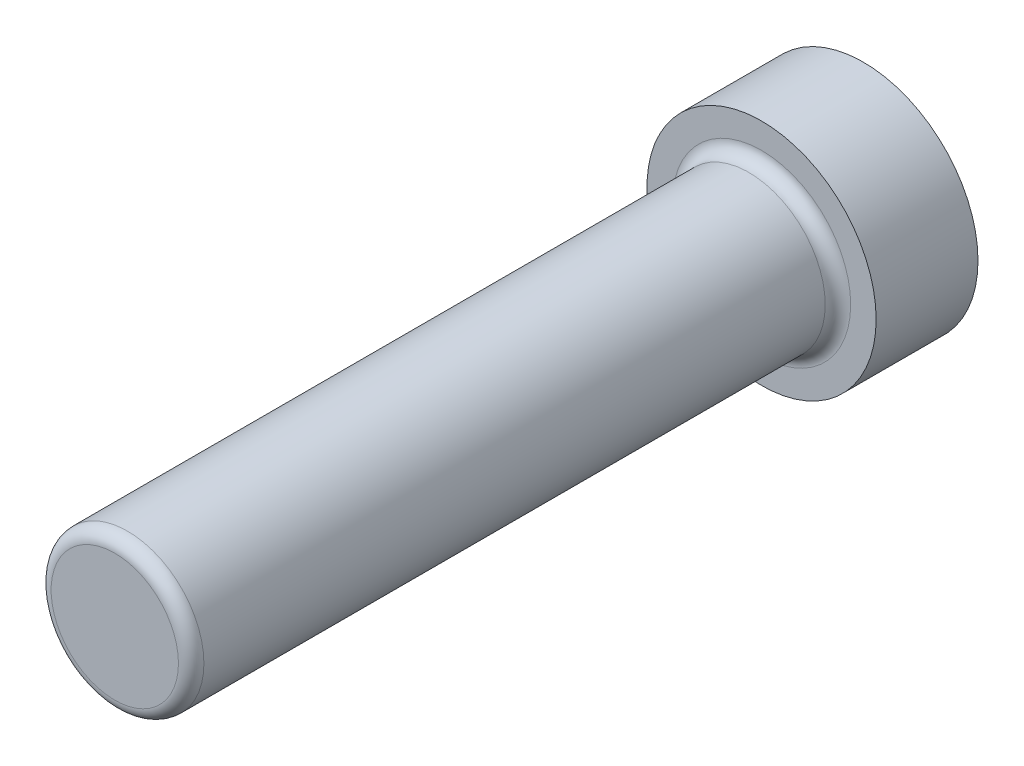
ISO-10303-21;
HEADER;
FILE_DESCRIPTION(('STEP AP214'),'2;1');
FILE_NAME('part.step','',(''),(''),'','','');
FILE_SCHEMA(('AUTOMOTIVE_DESIGN { 1 0 10303 214 1 1 1 1 }'));
ENDSEC;
DATA;
#1=APPLICATION_CONTEXT('core data for automotive mechanical design processes');
#2=APPLICATION_PROTOCOL_DEFINITION('international standard','automotive_design',2000,#1);
#3=PRODUCT_CONTEXT('',#1,'mechanical');
#4=PRODUCT('Part','Part','',(#3));
#5=PRODUCT_RELATED_PRODUCT_CATEGORY('part','',(#4));
#6=PRODUCT_DEFINITION_FORMATION('','',#4);
#7=PRODUCT_DEFINITION_CONTEXT('part definition',#1,'design');
#8=PRODUCT_DEFINITION('design','',#6,#7);
#9=PRODUCT_DEFINITION_SHAPE('','',#8);
#10=(LENGTH_UNIT() NAMED_UNIT(*) SI_UNIT(.MILLI.,.METRE.));
#11=(NAMED_UNIT(*) PLANE_ANGLE_UNIT() SI_UNIT($,.RADIAN.));
#12=(NAMED_UNIT(*) SI_UNIT($,.STERADIAN.) SOLID_ANGLE_UNIT());
#13=UNCERTAINTY_MEASURE_WITH_UNIT(LENGTH_MEASURE(1.E-05),#10,'distance_accuracy_value','');
#14=(GEOMETRIC_REPRESENTATION_CONTEXT(3) GLOBAL_UNCERTAINTY_ASSIGNED_CONTEXT((#13)) GLOBAL_UNIT_ASSIGNED_CONTEXT((#10,
#11,#12)) REPRESENTATION_CONTEXT('',''));
#15=CARTESIAN_POINT('',(0.,0.,0.));
#16=DIRECTION('',(0.,0.,1.));
#17=DIRECTION('',(1.,0.,0.));
#18=AXIS2_PLACEMENT_3D('',#15,#16,#17);
#19=CARTESIAN_POINT('',(0.,0.,12.7));
#20=DIRECTION('',(0.,0.,-1.));
#21=DIRECTION('',(-1.,0.,0.));
#22=AXIS2_PLACEMENT_3D('',#19,#20,#21);
#23=CYLINDRICAL_SURFACE('',#22,1.5);
#24=CARTESIAN_POINT('',(0.,0.,0.25));
#25=DIRECTION('',(0.,0.,1.));
#26=DIRECTION('',(1.,0.,0.));
#27=AXIS2_PLACEMENT_3D('',#24,#25,#26);
#28=CIRCLE('',#27,1.5);
#29=CARTESIAN_POINT('',(1.5,0.,0.25));
#30=VERTEX_POINT('',#29);
#31=EDGE_CURVE('E39',#30,#30,#28,.T.);
#32=ORIENTED_EDGE('',*,*,#31,.T.);
#33=EDGE_LOOP('',(#32));
#34=FACE_BOUND('',#33,.T.);
#35=CARTESIAN_POINT('',(0.,0.,12.45));
#36=DIRECTION('',(0.,0.,1.));
#37=DIRECTION('',(1.,0.,0.));
#38=AXIS2_PLACEMENT_3D('',#35,#36,#37);
#39=CIRCLE('',#38,1.5);
#40=CARTESIAN_POINT('',(1.5,0.,12.45));
#41=VERTEX_POINT('',#40);
#42=EDGE_CURVE('E43',#41,#41,#39,.F.);
#43=ORIENTED_EDGE('',*,*,#42,.T.);
#44=EDGE_LOOP('',(#43));
#45=FACE_BOUND('',#44,.T.);
#46=ADVANCED_FACE('F32',(#34,#45),#23,.T.);
#47=CARTESIAN_POINT('',(0.,0.,12.7));
#48=DIRECTION('',(0.,0.,1.));
#49=DIRECTION('',(1.,0.,0.));
#50=AXIS2_PLACEMENT_3D('',#47,#48,#49);
#51=PLANE('',#50);
#52=CARTESIAN_POINT('',(0.,0.,12.7));
#53=DIRECTION('',(0.,0.,1.));
#54=DIRECTION('',(1.,0.,0.));
#55=AXIS2_PLACEMENT_3D('',#52,#53,#54);
#56=CIRCLE('',#55,1.25);
#57=CARTESIAN_POINT('',(1.25,0.,12.7));
#58=VERTEX_POINT('',#57);
#59=EDGE_CURVE('E47',#58,#58,#56,.T.);
#60=ORIENTED_EDGE('',*,*,#59,.T.);
#61=EDGE_LOOP('',(#60));
#62=FACE_BOUND('',#61,.T.);
#63=ADVANCED_FACE('F72',(#62),#51,.T.);
#64=CARTESIAN_POINT('',(0.,0.,-2.));
#65=DIRECTION('',(0.,0.,1.));
#66=DIRECTION('',(1.,0.,0.));
#67=AXIS2_PLACEMENT_3D('',#64,#65,#66);
#68=CYLINDRICAL_SURFACE('',#67,2.25);
#69=CARTESIAN_POINT('',(0.,0.,-2.));
#70=DIRECTION('',(0.,0.,1.));
#71=DIRECTION('',(1.,0.,0.));
#72=AXIS2_PLACEMENT_3D('',#69,#70,#71);
#73=CIRCLE('',#72,2.25);
#74=CARTESIAN_POINT('',(2.25,0.,-2.));
#75=VERTEX_POINT('',#74);
#76=EDGE_CURVE('E52',#75,#75,#73,.T.);
#77=ORIENTED_EDGE('',*,*,#76,.T.);
#78=EDGE_LOOP('',(#77));
#79=FACE_BOUND('',#78,.T.);
#80=CARTESIAN_POINT('',(0.,0.,0.));
#81=DIRECTION('',(0.,0.,1.));
#82=DIRECTION('',(1.,0.,0.));
#83=AXIS2_PLACEMENT_3D('',#80,#81,#82);
#84=CIRCLE('',#83,2.25);
#85=CARTESIAN_POINT('',(2.25,0.,0.));
#86=VERTEX_POINT('',#85);
#87=EDGE_CURVE('E53',#86,#86,#84,.T.);
#88=ORIENTED_EDGE('',*,*,#87,.F.);
#89=EDGE_LOOP('',(#88));
#90=FACE_BOUND('',#89,.T.);
#91=ADVANCED_FACE('F59',(#79,#90),#68,.T.);
#92=CARTESIAN_POINT('',(0.,0.,-2.));
#93=DIRECTION('',(0.,0.,1.));
#94=DIRECTION('',(1.,0.,0.));
#95=AXIS2_PLACEMENT_3D('',#92,#93,#94);
#96=PLANE('',#95);
#97=ORIENTED_EDGE('',*,*,#76,.F.);
#98=EDGE_LOOP('',(#97));
#99=FACE_BOUND('',#98,.T.);
#100=ADVANCED_FACE('F62',(#99),#96,.F.);
#101=CARTESIAN_POINT('',(0.,0.,0.));
#102=DIRECTION('',(0.,0.,1.));
#103=DIRECTION('',(1.,0.,0.));
#104=AXIS2_PLACEMENT_3D('',#101,#102,#103);
#105=PLANE('',#104);
#106=CARTESIAN_POINT('',(0.,0.,0.));
#107=DIRECTION('',(0.,0.,1.));
#108=DIRECTION('',(1.,0.,0.));
#109=AXIS2_PLACEMENT_3D('',#106,#107,#108);
#110=CIRCLE('',#109,1.75);
#111=CARTESIAN_POINT('',(1.75,0.,0.));
#112=VERTEX_POINT('',#111);
#113=EDGE_CURVE('E10',#112,#112,#110,.F.);
#114=ORIENTED_EDGE('',*,*,#113,.T.);
#115=EDGE_LOOP('',(#114));
#116=FACE_BOUND('',#115,.T.);
#117=ORIENTED_EDGE('',*,*,#87,.T.);
#118=EDGE_LOOP('',(#117));
#119=FACE_BOUND('',#118,.T.);
#120=ADVANCED_FACE('F64',(#116,#119),#105,.T.);
#121=CARTESIAN_POINT('',(0.,0.,12.45));
#122=DIRECTION('',(0.,0.,1.));
#123=DIRECTION('',(1.,0.,0.));
#124=AXIS2_PLACEMENT_3D('',#121,#122,#123);
#125=TOROIDAL_SURFACE('',#124,1.25,0.25);
#126=ORIENTED_EDGE('',*,*,#42,.F.);
#127=EDGE_LOOP('',(#126));
#128=FACE_BOUND('',#127,.T.);
#129=ORIENTED_EDGE('',*,*,#59,.F.);
#130=EDGE_LOOP('',(#129));
#131=FACE_BOUND('',#130,.T.);
#132=ADVANCED_FACE('F70',(#128,#131),#125,.T.);
#133=CARTESIAN_POINT('',(0.,0.,0.25));
#134=DIRECTION('',(0.,0.,1.));
#135=DIRECTION('',(1.,0.,0.));
#136=AXIS2_PLACEMENT_3D('',#133,#134,#135);
#137=TOROIDAL_SURFACE('',#136,1.75,0.25);
#138=ORIENTED_EDGE('',*,*,#113,.F.);
#139=EDGE_LOOP('',(#138));
#140=FACE_BOUND('',#139,.T.);
#141=ORIENTED_EDGE('',*,*,#31,.F.);
#142=EDGE_LOOP('',(#141));
#143=FACE_BOUND('',#142,.T.);
#144=ADVANCED_FACE('F34',(#140,#143),#137,.F.);
#145=CLOSED_SHELL('',(#46,#63,#91,#100,#120,#132,#144));
#146=MANIFOLD_SOLID_BREP('B2',#145);
#147=ADVANCED_BREP_SHAPE_REPRESENTATION('',(#18,#146),#14);
#148=SHAPE_DEFINITION_REPRESENTATION(#9,#147);
ENDSEC;
END-ISO-10303-21;
